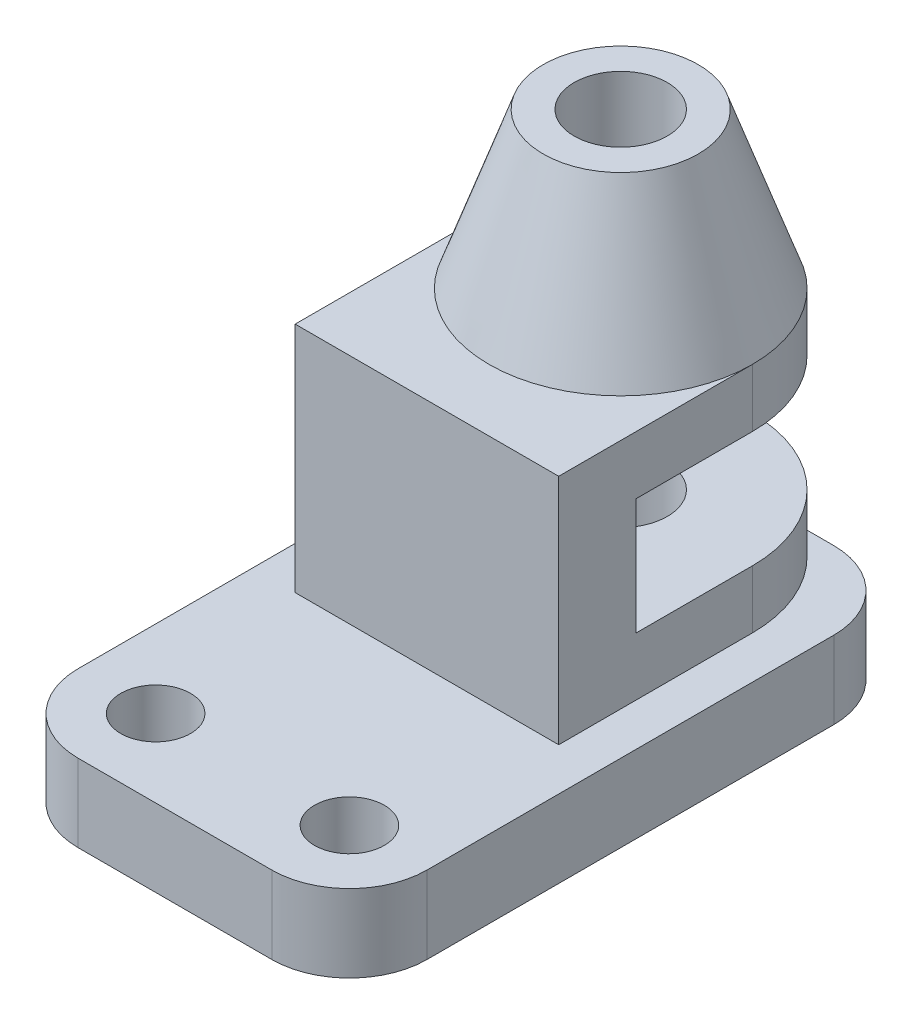
ISO-10303-21;
HEADER;
FILE_DESCRIPTION(('STEP AP214'),'2;1');
FILE_NAME('part.step','',(''),(''),'','','');
FILE_SCHEMA(('AUTOMOTIVE_DESIGN { 1 0 10303 214 1 1 1 1 }'));
ENDSEC;
DATA;
#1=APPLICATION_CONTEXT('core data for automotive mechanical design processes');
#2=APPLICATION_PROTOCOL_DEFINITION('international standard','automotive_design',2000,#1);
#3=PRODUCT_CONTEXT('',#1,'mechanical');
#4=PRODUCT('Part','Part','',(#3));
#5=PRODUCT_RELATED_PRODUCT_CATEGORY('part','',(#4));
#6=PRODUCT_DEFINITION_FORMATION('','',#4);
#7=PRODUCT_DEFINITION_CONTEXT('part definition',#1,'design');
#8=PRODUCT_DEFINITION('design','',#6,#7);
#9=PRODUCT_DEFINITION_SHAPE('','',#8);
#10=(LENGTH_UNIT() NAMED_UNIT(*) SI_UNIT(.MILLI.,.METRE.));
#11=(NAMED_UNIT(*) PLANE_ANGLE_UNIT() SI_UNIT($,.RADIAN.));
#12=(NAMED_UNIT(*) SI_UNIT($,.STERADIAN.) SOLID_ANGLE_UNIT());
#13=UNCERTAINTY_MEASURE_WITH_UNIT(LENGTH_MEASURE(1.E-05),#10,'distance_accuracy_value','');
#14=(GEOMETRIC_REPRESENTATION_CONTEXT(3) GLOBAL_UNCERTAINTY_ASSIGNED_CONTEXT((#13)) GLOBAL_UNIT_ASSIGNED_CONTEXT((#10,
#11,#12)) REPRESENTATION_CONTEXT('',''));
#15=CARTESIAN_POINT('',(0.,0.,0.));
#16=DIRECTION('',(0.,0.,1.));
#17=DIRECTION('',(1.,0.,0.));
#18=AXIS2_PLACEMENT_3D('',#15,#16,#17);
#19=CARTESIAN_POINT('',(0.,80.,-42.5));
#20=DIRECTION('',(0.,1.,0.));
#21=DIRECTION('',(0.,0.,1.));
#22=AXIS2_PLACEMENT_3D('',#19,#20,#21);
#23=PLANE('',#22);
#24=DIRECTION('',(0.,0.,-1.));
#25=VECTOR('',#24,1.);
#26=CARTESIAN_POINT('',(34.,80.,7.49999999999997));
#27=LINE('',#26,#25);
#28=CARTESIAN_POINT('',(34.,80.,7.49999999999997));
#29=VERTEX_POINT('',#28);
#30=CARTESIAN_POINT('',(34.,80.,-42.5));
#31=VERTEX_POINT('',#30);
#32=EDGE_CURVE('E186',#29,#31,#27,.T.);
#33=ORIENTED_EDGE('',*,*,#32,.T.);
#34=CARTESIAN_POINT('',(0.,80.,-42.5));
#35=DIRECTION('',(0.,-1.,0.));
#36=DIRECTION('',(1.,0.,0.));
#37=AXIS2_PLACEMENT_3D('',#34,#35,#36);
#38=CIRCLE('',#37,34.);
#39=CARTESIAN_POINT('',(-34.,80.,-42.5));
#40=VERTEX_POINT('',#39);
#41=EDGE_CURVE('E184',#31,#40,#38,.T.);
#42=ORIENTED_EDGE('',*,*,#41,.T.);
#43=DIRECTION('',(0.,0.,1.));
#44=VECTOR('',#43,1.);
#45=CARTESIAN_POINT('',(-34.,80.,-42.5));
#46=LINE('',#45,#44);
#47=CARTESIAN_POINT('',(-34.,80.,7.49999999999998));
#48=VERTEX_POINT('',#47);
#49=EDGE_CURVE('E164',#40,#48,#46,.T.);
#50=ORIENTED_EDGE('',*,*,#49,.T.);
#51=DIRECTION('',(1.,0.,0.));
#52=VECTOR('',#51,1.);
#53=CARTESIAN_POINT('',(-34.,80.,7.49999999999998));
#54=LINE('',#53,#52);
#55=EDGE_CURVE('E172',#48,#29,#54,.T.);
#56=ORIENTED_EDGE('',*,*,#55,.T.);
#57=EDGE_LOOP('',(#33,#42,#50,#56));
#58=FACE_BOUND('',#57,.T.);
#59=ADVANCED_FACE('F39',(#58),#23,.T.);
#60=CARTESIAN_POINT('',(-34.,80.,-42.5));
#61=DIRECTION('',(1.,0.,0.));
#62=DIRECTION('',(0.,0.,-1.));
#63=AXIS2_PLACEMENT_3D('',#60,#61,#62);
#64=PLANE('',#63);
#65=DIRECTION('',(0.,0.,1.));
#66=VECTOR('',#65,1.);
#67=CARTESIAN_POINT('',(-34.,35.,-42.5));
#68=LINE('',#67,#66);
#69=CARTESIAN_POINT('',(-34.,35.,-42.5));
#70=VERTEX_POINT('',#69);
#71=CARTESIAN_POINT('',(-34.,35.,-12.5));
#72=VERTEX_POINT('',#71);
#73=EDGE_CURVE('E335',#70,#72,#68,.T.);
#74=ORIENTED_EDGE('',*,*,#73,.F.);
#75=DIRECTION('',(0.,-1.,0.));
#76=VECTOR('',#75,1.);
#77=CARTESIAN_POINT('',(-34.,80.,-42.5));
#78=LINE('',#77,#76);
#79=CARTESIAN_POINT('',(-34.,20.,-42.5));
#80=VERTEX_POINT('',#79);
#81=EDGE_CURVE('E65',#70,#80,#78,.T.);
#82=ORIENTED_EDGE('',*,*,#81,.T.);
#83=DIRECTION('',(0.,0.,1.));
#84=VECTOR('',#83,1.);
#85=CARTESIAN_POINT('',(-34.,20.,-42.5));
#86=LINE('',#85,#84);
#87=CARTESIAN_POINT('',(-34.,20.,7.49999999999998));
#88=VERTEX_POINT('',#87);
#89=EDGE_CURVE('E197',#80,#88,#86,.T.);
#90=ORIENTED_EDGE('',*,*,#89,.T.);
#91=DIRECTION('',(0.,-1.,0.));
#92=VECTOR('',#91,1.);
#93=CARTESIAN_POINT('',(-34.,80.,7.49999999999998));
#94=LINE('',#93,#92);
#95=EDGE_CURVE('E169',#48,#88,#94,.T.);
#96=ORIENTED_EDGE('',*,*,#95,.F.);
#97=ORIENTED_EDGE('',*,*,#49,.F.);
#98=CARTESIAN_POINT('',(-34.,65.,-42.5));
#99=VERTEX_POINT('',#98);
#100=EDGE_CURVE('E167',#40,#99,#78,.T.);
#101=ORIENTED_EDGE('',*,*,#100,.T.);
#102=DIRECTION('',(0.,0.,1.));
#103=VECTOR('',#102,1.);
#104=CARTESIAN_POINT('',(-34.,65.,-42.5));
#105=LINE('',#104,#103);
#106=CARTESIAN_POINT('',(-34.,65.,-12.5));
#107=VERTEX_POINT('',#106);
#108=EDGE_CURVE('E57',#99,#107,#105,.T.);
#109=ORIENTED_EDGE('',*,*,#108,.T.);
#110=DIRECTION('',(0.,1.,0.));
#111=VECTOR('',#110,1.);
#112=CARTESIAN_POINT('',(-34.,35.,-12.5));
#113=LINE('',#112,#111);
#114=EDGE_CURVE('E329',#72,#107,#113,.T.);
#115=ORIENTED_EDGE('',*,*,#114,.F.);
#116=EDGE_LOOP('',(#74,#82,#90,#96,#97,#101,#109,#115));
#117=FACE_BOUND('',#116,.T.);
#118=ADVANCED_FACE('F166',(#117),#64,.F.);
#119=CARTESIAN_POINT('',(34.,80.,7.49999999999997));
#120=DIRECTION('',(-1.,0.,0.));
#121=DIRECTION('',(0.,0.,1.));
#122=AXIS2_PLACEMENT_3D('',#119,#120,#121);
#123=PLANE('',#122);
#124=DIRECTION('',(0.,0.,-1.));
#125=VECTOR('',#124,1.);
#126=CARTESIAN_POINT('',(34.,35.,-12.5));
#127=LINE('',#126,#125);
#128=CARTESIAN_POINT('',(34.,35.,-12.5));
#129=VERTEX_POINT('',#128);
#130=CARTESIAN_POINT('',(34.,35.,-42.5));
#131=VERTEX_POINT('',#130);
#132=EDGE_CURVE('E344',#129,#131,#127,.T.);
#133=ORIENTED_EDGE('',*,*,#132,.F.);
#134=DIRECTION('',(0.,1.,0.));
#135=VECTOR('',#134,1.);
#136=CARTESIAN_POINT('',(34.,35.,-12.5));
#137=LINE('',#136,#135);
#138=CARTESIAN_POINT('',(34.,65.,-12.5));
#139=VERTEX_POINT('',#138);
#140=EDGE_CURVE('E200',#129,#139,#137,.T.);
#141=ORIENTED_EDGE('',*,*,#140,.T.);
#142=DIRECTION('',(0.,0.,-1.));
#143=VECTOR('',#142,1.);
#144=CARTESIAN_POINT('',(34.,65.,-12.5));
#145=LINE('',#144,#143);
#146=CARTESIAN_POINT('',(34.,65.,-42.5));
#147=VERTEX_POINT('',#146);
#148=EDGE_CURVE('E336',#139,#147,#145,.T.);
#149=ORIENTED_EDGE('',*,*,#148,.T.);
#150=DIRECTION('',(0.,-1.,0.));
#151=VECTOR('',#150,1.);
#152=CARTESIAN_POINT('',(34.,80.,-42.5));
#153=LINE('',#152,#151);
#154=EDGE_CURVE('E207',#31,#147,#153,.T.);
#155=ORIENTED_EDGE('',*,*,#154,.F.);
#156=ORIENTED_EDGE('',*,*,#32,.F.);
#157=DIRECTION('',(0.,-1.,0.));
#158=VECTOR('',#157,1.);
#159=CARTESIAN_POINT('',(34.,80.,7.49999999999997));
#160=LINE('',#159,#158);
#161=CARTESIAN_POINT('',(34.,20.,7.49999999999997));
#162=VERTEX_POINT('',#161);
#163=EDGE_CURVE('E209',#29,#162,#160,.T.);
#164=ORIENTED_EDGE('',*,*,#163,.T.);
#165=DIRECTION('',(0.,0.,-1.));
#166=VECTOR('',#165,1.);
#167=CARTESIAN_POINT('',(34.,20.,7.49999999999997));
#168=LINE('',#167,#166);
#169=CARTESIAN_POINT('',(34.,20.,-42.5));
#170=VERTEX_POINT('',#169);
#171=EDGE_CURVE('E203',#162,#170,#168,.T.);
#172=ORIENTED_EDGE('',*,*,#171,.T.);
#173=EDGE_CURVE('E182',#131,#170,#153,.T.);
#174=ORIENTED_EDGE('',*,*,#173,.F.);
#175=EDGE_LOOP('',(#133,#141,#149,#155,#156,#164,#172,#174));
#176=FACE_BOUND('',#175,.T.);
#177=ADVANCED_FACE('F324',(#176),#123,.F.);
#178=CARTESIAN_POINT('',(0.,80.,-42.5));
#179=DIRECTION('',(0.,-1.,0.));
#180=DIRECTION('',(0.,0.,-1.));
#181=AXIS2_PLACEMENT_3D('',#178,#179,#180);
#182=CYLINDRICAL_SURFACE('',#181,34.);
#183=CARTESIAN_POINT('',(0.,35.,-42.5));
#184=DIRECTION('',(0.,1.,0.));
#185=DIRECTION('',(0.,0.,1.));
#186=AXIS2_PLACEMENT_3D('',#183,#184,#185);
#187=CIRCLE('',#186,34.);
#188=EDGE_CURVE('E331',#131,#70,#187,.T.);
#189=ORIENTED_EDGE('',*,*,#188,.F.);
#190=ORIENTED_EDGE('',*,*,#173,.T.);
#191=CARTESIAN_POINT('',(0.,20.,-42.5));
#192=DIRECTION('',(0.,1.,0.));
#193=DIRECTION('',(0.,0.,1.));
#194=AXIS2_PLACEMENT_3D('',#191,#192,#193);
#195=CIRCLE('',#194,34.);
#196=CARTESIAN_POINT('',(16.,20.,-72.5));
#197=VERTEX_POINT('',#196);
#198=EDGE_CURVE('E49',#170,#197,#195,.T.);
#199=ORIENTED_EDGE('',*,*,#198,.T.);
#200=CARTESIAN_POINT('',(-16.0000000000001,20.,-72.5));
#201=VERTEX_POINT('',#200);
#202=EDGE_CURVE('E50',#197,#201,#195,.T.);
#203=ORIENTED_EDGE('',*,*,#202,.T.);
#204=EDGE_CURVE('E11',#201,#80,#195,.T.);
#205=ORIENTED_EDGE('',*,*,#204,.T.);
#206=ORIENTED_EDGE('',*,*,#81,.F.);
#207=EDGE_LOOP('',(#189,#190,#199,#203,#205,#206));
#208=FACE_BOUND('',#207,.T.);
#209=ADVANCED_FACE('F319',(#208),#182,.T.);
#210=CARTESIAN_POINT('',(25.,20.,-52.5));
#211=DIRECTION('',(0.,1.,0.));
#212=DIRECTION('',(0.,0.,1.));
#213=AXIS2_PLACEMENT_3D('',#210,#211,#212);
#214=PLANE('',#213);
#215=ORIENTED_EDGE('',*,*,#204,.F.);
#216=DIRECTION('',(-1.,0.,0.));
#217=VECTOR('',#216,1.);
#218=CARTESIAN_POINT('',(-24.9999999999998,20.,-72.5));
#219=LINE('',#218,#217);
#220=CARTESIAN_POINT('',(-24.9999999999998,20.,-72.5));
#221=VERTEX_POINT('',#220);
#222=EDGE_CURVE('E229',#201,#221,#219,.T.);
#223=ORIENTED_EDGE('',*,*,#222,.T.);
#224=CARTESIAN_POINT('',(-25.,20.,-52.5));
#225=DIRECTION('',(0.,1.,0.));
#226=DIRECTION('',(0.,0.,1.));
#227=AXIS2_PLACEMENT_3D('',#224,#225,#226);
#228=CIRCLE('',#227,20.);
#229=CARTESIAN_POINT('',(-45.,20.,-52.4999999999999));
#230=VERTEX_POINT('',#229);
#231=EDGE_CURVE('E234',#221,#230,#228,.T.);
#232=ORIENTED_EDGE('',*,*,#231,.T.);
#233=DIRECTION('',(0.,0.,1.));
#234=VECTOR('',#233,1.);
#235=CARTESIAN_POINT('',(-45.,20.,52.4999999999998));
#236=LINE('',#235,#234);
#237=CARTESIAN_POINT('',(-45.,20.,52.4999999999998));
#238=VERTEX_POINT('',#237);
#239=EDGE_CURVE('E237',#230,#238,#236,.T.);
#240=ORIENTED_EDGE('',*,*,#239,.T.);
#241=CARTESIAN_POINT('',(-25.,20.,52.5));
#242=DIRECTION('',(0.,1.,0.));
#243=DIRECTION('',(0.,0.,-1.));
#244=AXIS2_PLACEMENT_3D('',#241,#242,#243);
#245=CIRCLE('',#244,20.);
#246=CARTESIAN_POINT('',(-24.9999999999999,20.,72.5));
#247=VERTEX_POINT('',#246);
#248=EDGE_CURVE('E239',#238,#247,#245,.T.);
#249=ORIENTED_EDGE('',*,*,#248,.T.);
#250=DIRECTION('',(1.,0.,0.));
#251=VECTOR('',#250,1.);
#252=CARTESIAN_POINT('',(-24.9999999999999,20.,72.5));
#253=LINE('',#252,#251);
#254=CARTESIAN_POINT('',(24.9999999999999,20.,72.5));
#255=VERTEX_POINT('',#254);
#256=EDGE_CURVE('E241',#247,#255,#253,.T.);
#257=ORIENTED_EDGE('',*,*,#256,.T.);
#258=CARTESIAN_POINT('',(25.,20.,52.5));
#259=DIRECTION('',(0.,1.,0.));
#260=DIRECTION('',(0.,0.,-1.));
#261=AXIS2_PLACEMENT_3D('',#258,#259,#260);
#262=CIRCLE('',#261,20.);
#263=CARTESIAN_POINT('',(45.,20.,52.4999999999998));
#264=VERTEX_POINT('',#263);
#265=EDGE_CURVE('E243',#255,#264,#262,.T.);
#266=ORIENTED_EDGE('',*,*,#265,.T.);
#267=DIRECTION('',(0.,0.,-1.));
#268=VECTOR('',#267,1.);
#269=CARTESIAN_POINT('',(45.,20.,52.4999999999998));
#270=LINE('',#269,#268);
#271=CARTESIAN_POINT('',(45.,20.,-52.4999999999999));
#272=VERTEX_POINT('',#271);
#273=EDGE_CURVE('E245',#264,#272,#270,.T.);
#274=ORIENTED_EDGE('',*,*,#273,.T.);
#275=CARTESIAN_POINT('',(25.,20.,-52.5));
#276=DIRECTION('',(0.,1.,0.));
#277=DIRECTION('',(0.,0.,1.));
#278=AXIS2_PLACEMENT_3D('',#275,#276,#277);
#279=CIRCLE('',#278,20.);
#280=CARTESIAN_POINT('',(24.9999999999999,20.,-72.5));
#281=VERTEX_POINT('',#280);
#282=EDGE_CURVE('E226',#272,#281,#279,.T.);
#283=ORIENTED_EDGE('',*,*,#282,.T.);
#284=EDGE_CURVE('E231',#281,#197,#219,.T.);
#285=ORIENTED_EDGE('',*,*,#284,.T.);
#286=ORIENTED_EDGE('',*,*,#198,.F.);
#287=ORIENTED_EDGE('',*,*,#171,.F.);
#288=DIRECTION('',(1.,0.,0.));
#289=VECTOR('',#288,1.);
#290=CARTESIAN_POINT('',(-34.,20.,7.49999999999998));
#291=LINE('',#290,#289);
#292=EDGE_CURVE('E199',#88,#162,#291,.T.);
#293=ORIENTED_EDGE('',*,*,#292,.F.);
#294=ORIENTED_EDGE('',*,*,#89,.F.);
#295=EDGE_LOOP('',(#215,#223,#232,#240,#249,#257,#266,#274,#283,#285,#286,#287,#293,#294));
#296=FACE_BOUND('',#295,.T.);
#297=CARTESIAN_POINT('',(25.,20.,52.5));
#298=DIRECTION('',(0.,1.,0.));
#299=DIRECTION('',(0.,0.,1.));
#300=AXIS2_PLACEMENT_3D('',#297,#298,#299);
#301=CIRCLE('',#300,9.);
#302=CARTESIAN_POINT('',(25.,20.,61.5));
#303=VERTEX_POINT('',#302);
#304=EDGE_CURVE('E220',#303,#303,#301,.T.);
#305=ORIENTED_EDGE('',*,*,#304,.F.);
#306=EDGE_LOOP('',(#305));
#307=FACE_BOUND('',#306,.T.);
#308=CARTESIAN_POINT('',(-25.,20.,52.5));
#309=DIRECTION('',(0.,1.,0.));
#310=DIRECTION('',(0.,0.,1.));
#311=AXIS2_PLACEMENT_3D('',#308,#309,#310);
#312=CIRCLE('',#311,9.);
#313=CARTESIAN_POINT('',(-25.,20.,61.5));
#314=VERTEX_POINT('',#313);
#315=EDGE_CURVE('E214',#314,#314,#312,.T.);
#316=ORIENTED_EDGE('',*,*,#315,.F.);
#317=EDGE_LOOP('',(#316));
#318=FACE_BOUND('',#317,.T.);
#319=ADVANCED_FACE('F308',(#296,#307,#318),#214,.T.);
#320=CARTESIAN_POINT('',(25.,0.,-52.5));
#321=DIRECTION('',(0.,1.,0.));
#322=DIRECTION('',(0.,0.,1.));
#323=AXIS2_PLACEMENT_3D('',#320,#321,#322);
#324=PLANE('',#323);
#325=CARTESIAN_POINT('',(0.,0.,-42.5));
#326=DIRECTION('',(0.,1.,0.));
#327=DIRECTION('',(-1.,0.,0.));
#328=AXIS2_PLACEMENT_3D('',#325,#326,#327);
#329=CIRCLE('',#328,12.);
#330=CARTESIAN_POINT('',(-12.,0.,-42.5));
#331=VERTEX_POINT('',#330);
#332=EDGE_CURVE('E358',#331,#331,#329,.T.);
#333=ORIENTED_EDGE('',*,*,#332,.T.);
#334=EDGE_LOOP('',(#333));
#335=FACE_BOUND('',#334,.T.);
#336=CARTESIAN_POINT('',(25.,0.,-52.5));
#337=DIRECTION('',(0.,1.,0.));
#338=DIRECTION('',(0.,0.,1.));
#339=AXIS2_PLACEMENT_3D('',#336,#337,#338);
#340=CIRCLE('',#339,20.);
#341=CARTESIAN_POINT('',(45.,0.,-52.4999999999999));
#342=VERTEX_POINT('',#341);
#343=CARTESIAN_POINT('',(24.9999999999999,0.,-72.5));
#344=VERTEX_POINT('',#343);
#345=EDGE_CURVE('E223',#342,#344,#340,.T.);
#346=ORIENTED_EDGE('',*,*,#345,.F.);
#347=DIRECTION('',(0.,0.,-1.));
#348=VECTOR('',#347,1.);
#349=CARTESIAN_POINT('',(45.,0.,52.4999999999998));
#350=LINE('',#349,#348);
#351=CARTESIAN_POINT('',(45.,0.,52.4999999999998));
#352=VERTEX_POINT('',#351);
#353=EDGE_CURVE('E230',#352,#342,#350,.T.);
#354=ORIENTED_EDGE('',*,*,#353,.F.);
#355=CARTESIAN_POINT('',(25.,0.,52.5));
#356=DIRECTION('',(0.,1.,0.));
#357=DIRECTION('',(0.,0.,-1.));
#358=AXIS2_PLACEMENT_3D('',#355,#356,#357);
#359=CIRCLE('',#358,20.);
#360=CARTESIAN_POINT('',(24.9999999999999,0.,72.5));
#361=VERTEX_POINT('',#360);
#362=EDGE_CURVE('E260',#361,#352,#359,.T.);
#363=ORIENTED_EDGE('',*,*,#362,.F.);
#364=DIRECTION('',(1.,0.,0.));
#365=VECTOR('',#364,1.);
#366=CARTESIAN_POINT('',(-24.9999999999999,0.,72.5));
#367=LINE('',#366,#365);
#368=CARTESIAN_POINT('',(-24.9999999999999,0.,72.5));
#369=VERTEX_POINT('',#368);
#370=EDGE_CURVE('E258',#369,#361,#367,.T.);
#371=ORIENTED_EDGE('',*,*,#370,.F.);
#372=CARTESIAN_POINT('',(-25.,0.,52.5));
#373=DIRECTION('',(0.,1.,0.));
#374=DIRECTION('',(0.,0.,-1.));
#375=AXIS2_PLACEMENT_3D('',#372,#373,#374);
#376=CIRCLE('',#375,20.);
#377=CARTESIAN_POINT('',(-45.,0.,52.4999999999998));
#378=VERTEX_POINT('',#377);
#379=EDGE_CURVE('E256',#378,#369,#376,.T.);
#380=ORIENTED_EDGE('',*,*,#379,.F.);
#381=DIRECTION('',(0.,0.,1.));
#382=VECTOR('',#381,1.);
#383=CARTESIAN_POINT('',(-45.,0.,52.4999999999998));
#384=LINE('',#383,#382);
#385=CARTESIAN_POINT('',(-45.,0.,-52.4999999999999));
#386=VERTEX_POINT('',#385);
#387=EDGE_CURVE('E254',#386,#378,#384,.T.);
#388=ORIENTED_EDGE('',*,*,#387,.F.);
#389=CARTESIAN_POINT('',(-25.,0.,-52.5));
#390=DIRECTION('',(0.,1.,0.));
#391=DIRECTION('',(0.,0.,1.));
#392=AXIS2_PLACEMENT_3D('',#389,#390,#391);
#393=CIRCLE('',#392,20.);
#394=CARTESIAN_POINT('',(-24.9999999999998,0.,-72.5));
#395=VERTEX_POINT('',#394);
#396=EDGE_CURVE('E252',#395,#386,#393,.T.);
#397=ORIENTED_EDGE('',*,*,#396,.F.);
#398=DIRECTION('',(-1.,0.,0.));
#399=VECTOR('',#398,1.);
#400=CARTESIAN_POINT('',(-24.9999999999998,0.,-72.5));
#401=LINE('',#400,#399);
#402=EDGE_CURVE('E250',#344,#395,#401,.T.);
#403=ORIENTED_EDGE('',*,*,#402,.F.);
#404=EDGE_LOOP('',(#346,#354,#363,#371,#380,#388,#397,#403));
#405=FACE_BOUND('',#404,.T.);
#406=CARTESIAN_POINT('',(25.,0.,52.5));
#407=DIRECTION('',(0.,1.,0.));
#408=DIRECTION('',(0.,0.,1.));
#409=AXIS2_PLACEMENT_3D('',#406,#407,#408);
#410=CIRCLE('',#409,9.);
#411=CARTESIAN_POINT('',(25.,0.,61.5));
#412=VERTEX_POINT('',#411);
#413=EDGE_CURVE('E217',#412,#412,#410,.T.);
#414=ORIENTED_EDGE('',*,*,#413,.T.);
#415=EDGE_LOOP('',(#414));
#416=FACE_BOUND('',#415,.T.);
#417=CARTESIAN_POINT('',(-25.,0.,52.5));
#418=DIRECTION('',(0.,1.,0.));
#419=DIRECTION('',(0.,0.,1.));
#420=AXIS2_PLACEMENT_3D('',#417,#418,#419);
#421=CIRCLE('',#420,9.);
#422=CARTESIAN_POINT('',(-25.,0.,61.5));
#423=VERTEX_POINT('',#422);
#424=EDGE_CURVE('E213',#423,#423,#421,.T.);
#425=ORIENTED_EDGE('',*,*,#424,.T.);
#426=EDGE_LOOP('',(#425));
#427=FACE_BOUND('',#426,.T.);
#428=ADVANCED_FACE('F295',(#335,#405,#416,#427),#324,.F.);
#429=CARTESIAN_POINT('',(25.,20.,-52.5));
#430=DIRECTION('',(0.,-1.,0.));
#431=DIRECTION('',(0.,0.,-1.));
#432=AXIS2_PLACEMENT_3D('',#429,#430,#431);
#433=CYLINDRICAL_SURFACE('',#432,20.);
#434=ORIENTED_EDGE('',*,*,#345,.T.);
#435=DIRECTION('',(0.,-1.,0.));
#436=VECTOR('',#435,1.);
#437=CARTESIAN_POINT('',(24.9999999999999,20.,-72.5));
#438=LINE('',#437,#436);
#439=EDGE_CURVE('E43',#281,#344,#438,.T.);
#440=ORIENTED_EDGE('',*,*,#439,.F.);
#441=ORIENTED_EDGE('',*,*,#282,.F.);
#442=DIRECTION('',(0.,-1.,0.));
#443=VECTOR('',#442,1.);
#444=CARTESIAN_POINT('',(45.,20.,-52.4999999999999));
#445=LINE('',#444,#443);
#446=EDGE_CURVE('E247',#272,#342,#445,.T.);
#447=ORIENTED_EDGE('',*,*,#446,.T.);
#448=EDGE_LOOP('',(#434,#440,#441,#447));
#449=FACE_BOUND('',#448,.T.);
#450=ADVANCED_FACE('F41',(#449),#433,.T.);
#451=CARTESIAN_POINT('',(-24.9999999999998,20.,-72.5));
#452=DIRECTION('',(0.,0.,1.));
#453=DIRECTION('',(1.,0.,0.));
#454=AXIS2_PLACEMENT_3D('',#451,#452,#453);
#455=PLANE('',#454);
#456=ORIENTED_EDGE('',*,*,#402,.T.);
#457=DIRECTION('',(0.,-1.,0.));
#458=VECTOR('',#457,1.);
#459=CARTESIAN_POINT('',(-24.9999999999998,20.,-72.5));
#460=LINE('',#459,#458);
#461=EDGE_CURVE('E279',#221,#395,#460,.T.);
#462=ORIENTED_EDGE('',*,*,#461,.F.);
#463=ORIENTED_EDGE('',*,*,#222,.F.);
#464=EDGE_CURVE('E235',#197,#201,#219,.T.);
#465=ORIENTED_EDGE('',*,*,#464,.F.);
#466=ORIENTED_EDGE('',*,*,#284,.F.);
#467=ORIENTED_EDGE('',*,*,#439,.T.);
#468=EDGE_LOOP('',(#456,#462,#463,#465,#466,#467));
#469=FACE_BOUND('',#468,.T.);
#470=ADVANCED_FACE('F288',(#469),#455,.F.);
#471=CARTESIAN_POINT('',(-25.,20.,-52.5));
#472=DIRECTION('',(0.,-1.,0.));
#473=DIRECTION('',(0.,0.,-1.));
#474=AXIS2_PLACEMENT_3D('',#471,#472,#473);
#475=CYLINDRICAL_SURFACE('',#474,20.);
#476=ORIENTED_EDGE('',*,*,#396,.T.);
#477=DIRECTION('',(0.,-1.,0.));
#478=VECTOR('',#477,1.);
#479=CARTESIAN_POINT('',(-45.,20.,-52.4999999999999));
#480=LINE('',#479,#478);
#481=EDGE_CURVE('E277',#230,#386,#480,.T.);
#482=ORIENTED_EDGE('',*,*,#481,.F.);
#483=ORIENTED_EDGE('',*,*,#231,.F.);
#484=ORIENTED_EDGE('',*,*,#461,.T.);
#485=EDGE_LOOP('',(#476,#482,#483,#484));
#486=FACE_BOUND('',#485,.T.);
#487=ADVANCED_FACE('F301',(#486),#475,.T.);
#488=CARTESIAN_POINT('',(-45.,20.,52.4999999999998));
#489=DIRECTION('',(1.,0.,0.));
#490=DIRECTION('',(0.,0.,-1.));
#491=AXIS2_PLACEMENT_3D('',#488,#489,#490);
#492=PLANE('',#491);
#493=ORIENTED_EDGE('',*,*,#387,.T.);
#494=DIRECTION('',(0.,-1.,0.));
#495=VECTOR('',#494,1.);
#496=CARTESIAN_POINT('',(-45.,20.,52.4999999999998));
#497=LINE('',#496,#495);
#498=EDGE_CURVE('E274',#238,#378,#497,.T.);
#499=ORIENTED_EDGE('',*,*,#498,.F.);
#500=ORIENTED_EDGE('',*,*,#239,.F.);
#501=ORIENTED_EDGE('',*,*,#481,.T.);
#502=EDGE_LOOP('',(#493,#499,#500,#501));
#503=FACE_BOUND('',#502,.T.);
#504=ADVANCED_FACE('F304',(#503),#492,.F.);
#505=CARTESIAN_POINT('',(-25.,20.,52.5));
#506=DIRECTION('',(0.,-1.,0.));
#507=DIRECTION('',(0.,0.,-1.));
#508=AXIS2_PLACEMENT_3D('',#505,#506,#507);
#509=CYLINDRICAL_SURFACE('',#508,20.);
#510=ORIENTED_EDGE('',*,*,#379,.T.);
#511=DIRECTION('',(0.,-1.,0.));
#512=VECTOR('',#511,1.);
#513=CARTESIAN_POINT('',(-24.9999999999999,20.,72.5));
#514=LINE('',#513,#512);
#515=EDGE_CURVE('E271',#247,#369,#514,.T.);
#516=ORIENTED_EDGE('',*,*,#515,.F.);
#517=ORIENTED_EDGE('',*,*,#248,.F.);
#518=ORIENTED_EDGE('',*,*,#498,.T.);
#519=EDGE_LOOP('',(#510,#516,#517,#518));
#520=FACE_BOUND('',#519,.T.);
#521=ADVANCED_FACE('F418',(#520),#509,.T.);
#522=CARTESIAN_POINT('',(-24.9999999999999,20.,72.5));
#523=DIRECTION('',(0.,0.,-1.));
#524=DIRECTION('',(-1.,0.,0.));
#525=AXIS2_PLACEMENT_3D('',#522,#523,#524);
#526=PLANE('',#525);
#527=ORIENTED_EDGE('',*,*,#370,.T.);
#528=DIRECTION('',(0.,-1.,0.));
#529=VECTOR('',#528,1.);
#530=CARTESIAN_POINT('',(24.9999999999999,20.,72.5));
#531=LINE('',#530,#529);
#532=EDGE_CURVE('E268',#255,#361,#531,.T.);
#533=ORIENTED_EDGE('',*,*,#532,.F.);
#534=ORIENTED_EDGE('',*,*,#256,.F.);
#535=ORIENTED_EDGE('',*,*,#515,.T.);
#536=EDGE_LOOP('',(#527,#533,#534,#535));
#537=FACE_BOUND('',#536,.T.);
#538=ADVANCED_FACE('F414',(#537),#526,.F.);
#539=CARTESIAN_POINT('',(25.,20.,52.5));
#540=DIRECTION('',(0.,-1.,0.));
#541=DIRECTION('',(0.,0.,-1.));
#542=AXIS2_PLACEMENT_3D('',#539,#540,#541);
#543=CYLINDRICAL_SURFACE('',#542,20.);
#544=ORIENTED_EDGE('',*,*,#362,.T.);
#545=DIRECTION('',(0.,-1.,0.));
#546=VECTOR('',#545,1.);
#547=CARTESIAN_POINT('',(45.,20.,52.4999999999998));
#548=LINE('',#547,#546);
#549=EDGE_CURVE('E265',#264,#352,#548,.T.);
#550=ORIENTED_EDGE('',*,*,#549,.F.);
#551=ORIENTED_EDGE('',*,*,#265,.F.);
#552=ORIENTED_EDGE('',*,*,#532,.T.);
#553=EDGE_LOOP('',(#544,#550,#551,#552));
#554=FACE_BOUND('',#553,.T.);
#555=ADVANCED_FACE('F410',(#554),#543,.T.);
#556=CARTESIAN_POINT('',(45.,20.,52.4999999999998));
#557=DIRECTION('',(-1.,0.,0.));
#558=DIRECTION('',(0.,0.,1.));
#559=AXIS2_PLACEMENT_3D('',#556,#557,#558);
#560=PLANE('',#559);
#561=ORIENTED_EDGE('',*,*,#353,.T.);
#562=ORIENTED_EDGE('',*,*,#446,.F.);
#563=ORIENTED_EDGE('',*,*,#273,.F.);
#564=ORIENTED_EDGE('',*,*,#549,.T.);
#565=EDGE_LOOP('',(#561,#562,#563,#564));
#566=FACE_BOUND('',#565,.T.);
#567=ADVANCED_FACE('F402',(#566),#560,.F.);
#568=CARTESIAN_POINT('',(25.,20.,52.5));
#569=DIRECTION('',(0.,-1.,0.));
#570=DIRECTION('',(0.,0.,-1.));
#571=AXIS2_PLACEMENT_3D('',#568,#569,#570);
#572=CYLINDRICAL_SURFACE('',#571,9.);
#573=ORIENTED_EDGE('',*,*,#304,.T.);
#574=EDGE_LOOP('',(#573));
#575=FACE_BOUND('',#574,.T.);
#576=ORIENTED_EDGE('',*,*,#413,.F.);
#577=EDGE_LOOP('',(#576));
#578=FACE_BOUND('',#577,.T.);
#579=ADVANCED_FACE('F398',(#575,#578),#572,.F.);
#580=CARTESIAN_POINT('',(-25.,20.,52.5));
#581=DIRECTION('',(0.,-1.,0.));
#582=DIRECTION('',(0.,0.,-1.));
#583=AXIS2_PLACEMENT_3D('',#580,#581,#582);
#584=CYLINDRICAL_SURFACE('',#583,9.);
#585=ORIENTED_EDGE('',*,*,#315,.T.);
#586=EDGE_LOOP('',(#585));
#587=FACE_BOUND('',#586,.T.);
#588=ORIENTED_EDGE('',*,*,#424,.F.);
#589=EDGE_LOOP('',(#588));
#590=FACE_BOUND('',#589,.T.);
#591=ADVANCED_FACE('F390',(#587,#590),#584,.F.);
#592=CARTESIAN_POINT('',(0.,20.,-42.5));
#593=DIRECTION('',(0.,1.,0.));
#594=DIRECTION('',(0.,0.,1.));
#595=AXIS2_PLACEMENT_3D('',#592,#593,#594);
#596=PLANE('',#595);
#597=ORIENTED_EDGE('',*,*,#202,.F.);
#598=ORIENTED_EDGE('',*,*,#464,.T.);
#599=EDGE_LOOP('',(#597,#598));
#600=FACE_BOUND('',#599,.T.);
#601=ADVANCED_FACE('F316',(#600),#596,.F.);
#602=CARTESIAN_POINT('',(-34.,80.,7.49999999999998));
#603=DIRECTION('',(0.,0.,-1.));
#604=DIRECTION('',(-1.,0.,0.));
#605=AXIS2_PLACEMENT_3D('',#602,#603,#604);
#606=PLANE('',#605);
#607=ORIENTED_EDGE('',*,*,#292,.T.);
#608=ORIENTED_EDGE('',*,*,#163,.F.);
#609=ORIENTED_EDGE('',*,*,#55,.F.);
#610=ORIENTED_EDGE('',*,*,#95,.T.);
#611=EDGE_LOOP('',(#607,#608,#609,#610));
#612=FACE_BOUND('',#611,.T.);
#613=ADVANCED_FACE('F327',(#612),#606,.F.);
#614=ORIENTED_EDGE('',*,*,#154,.T.);
#615=CARTESIAN_POINT('',(0.,65.,-42.5));
#616=DIRECTION('',(0.,1.,0.));
#617=DIRECTION('',(0.,0.,1.));
#618=AXIS2_PLACEMENT_3D('',#615,#616,#617);
#619=CIRCLE('',#618,34.);
#620=EDGE_CURVE('E181',#147,#99,#619,.T.);
#621=ORIENTED_EDGE('',*,*,#620,.T.);
#622=ORIENTED_EDGE('',*,*,#100,.F.);
#623=CARTESIAN_POINT('',(0.,80.,-42.5));
#624=DIRECTION('',(0.,1.,0.));
#625=DIRECTION('',(0.,0.,1.));
#626=AXIS2_PLACEMENT_3D('',#623,#624,#625);
#627=CIRCLE('',#626,34.);
#628=EDGE_CURVE('E179',#31,#40,#627,.T.);
#629=ORIENTED_EDGE('',*,*,#628,.F.);
#630=EDGE_LOOP('',(#614,#621,#622,#629));
#631=FACE_BOUND('',#630,.T.);
#632=ADVANCED_FACE('F177',(#631),#182,.T.);
#633=CARTESIAN_POINT('',(-34.,35.,-12.5));
#634=DIRECTION('',(0.,0.,1.));
#635=DIRECTION('',(1.,0.,0.));
#636=AXIS2_PLACEMENT_3D('',#633,#634,#635);
#637=PLANE('',#636);
#638=DIRECTION('',(1.,0.,0.));
#639=VECTOR('',#638,1.);
#640=CARTESIAN_POINT('',(-34.,65.,-12.5));
#641=LINE('',#640,#639);
#642=EDGE_CURVE('E339',#107,#139,#641,.T.);
#643=ORIENTED_EDGE('',*,*,#642,.T.);
#644=ORIENTED_EDGE('',*,*,#140,.F.);
#645=DIRECTION('',(1.,0.,0.));
#646=VECTOR('',#645,1.);
#647=CARTESIAN_POINT('',(-34.,35.,-12.5));
#648=LINE('',#647,#646);
#649=EDGE_CURVE('E346',#72,#129,#648,.T.);
#650=ORIENTED_EDGE('',*,*,#649,.F.);
#651=ORIENTED_EDGE('',*,*,#114,.T.);
#652=EDGE_LOOP('',(#643,#644,#650,#651));
#653=FACE_BOUND('',#652,.T.);
#654=ADVANCED_FACE('F386',(#653),#637,.F.);
#655=CARTESIAN_POINT('',(0.,35.,-42.5));
#656=DIRECTION('',(0.,1.,0.));
#657=DIRECTION('',(0.,0.,1.));
#658=AXIS2_PLACEMENT_3D('',#655,#656,#657);
#659=PLANE('',#658);
#660=CARTESIAN_POINT('',(0.,35.,-42.5));
#661=DIRECTION('',(0.,1.,0.));
#662=DIRECTION('',(0.,0.,1.));
#663=AXIS2_PLACEMENT_3D('',#660,#661,#662);
#664=CIRCLE('',#663,12.);
#665=CARTESIAN_POINT('',(-12.,35.,-42.5));
#666=VERTEX_POINT('',#665);
#667=EDGE_CURVE('E190',#666,#666,#664,.T.);
#668=ORIENTED_EDGE('',*,*,#667,.F.);
#669=EDGE_LOOP('',(#668));
#670=FACE_BOUND('',#669,.T.);
#671=ORIENTED_EDGE('',*,*,#73,.T.);
#672=ORIENTED_EDGE('',*,*,#649,.T.);
#673=ORIENTED_EDGE('',*,*,#132,.T.);
#674=ORIENTED_EDGE('',*,*,#188,.T.);
#675=EDGE_LOOP('',(#671,#672,#673,#674));
#676=FACE_BOUND('',#675,.T.);
#677=ADVANCED_FACE('F492',(#670,#676),#659,.T.);
#678=CARTESIAN_POINT('',(0.,65.,-42.5));
#679=DIRECTION('',(0.,1.,0.));
#680=DIRECTION('',(0.,0.,1.));
#681=AXIS2_PLACEMENT_3D('',#678,#679,#680);
#682=PLANE('',#681);
#683=CARTESIAN_POINT('',(0.,65.,-42.5));
#684=DIRECTION('',(0.,1.,0.));
#685=DIRECTION('',(0.,0.,1.));
#686=AXIS2_PLACEMENT_3D('',#683,#684,#685);
#687=CIRCLE('',#686,12.);
#688=CARTESIAN_POINT('',(-12.,65.,-42.5));
#689=VERTEX_POINT('',#688);
#690=EDGE_CURVE('E355',#689,#689,#687,.T.);
#691=ORIENTED_EDGE('',*,*,#690,.T.);
#692=EDGE_LOOP('',(#691));
#693=FACE_BOUND('',#692,.T.);
#694=ORIENTED_EDGE('',*,*,#108,.F.);
#695=ORIENTED_EDGE('',*,*,#620,.F.);
#696=ORIENTED_EDGE('',*,*,#148,.F.);
#697=ORIENTED_EDGE('',*,*,#642,.F.);
#698=EDGE_LOOP('',(#694,#695,#696,#697));
#699=FACE_BOUND('',#698,.T.);
#700=ADVANCED_FACE('F496',(#693,#699),#682,.F.);
#701=CARTESIAN_POINT('',(0.,120.,-42.5));
#702=DIRECTION('',(0.,1.,0.));
#703=DIRECTION('',(-1.,0.,0.));
#704=AXIS2_PLACEMENT_3D('',#701,#702,#703);
#705=PLANE('',#704);
#706=CARTESIAN_POINT('',(0.,120.,-42.5));
#707=DIRECTION('',(0.,1.,0.));
#708=DIRECTION('',(-1.,0.,0.));
#709=AXIS2_PLACEMENT_3D('',#706,#707,#708);
#710=CIRCLE('',#709,12.);
#711=CARTESIAN_POINT('',(-12.,120.,-42.5));
#712=VERTEX_POINT('',#711);
#713=EDGE_CURVE('E359',#712,#712,#710,.T.);
#714=ORIENTED_EDGE('',*,*,#713,.F.);
#715=EDGE_LOOP('',(#714));
#716=FACE_BOUND('',#715,.T.);
#717=CARTESIAN_POINT('',(0.,120.,-42.5));
#718=DIRECTION('',(0.,-1.,0.));
#719=DIRECTION('',(1.,0.,0.));
#720=AXIS2_PLACEMENT_3D('',#717,#718,#719);
#721=CIRCLE('',#720,20.);
#722=CARTESIAN_POINT('',(20.,120.,-42.5));
#723=VERTEX_POINT('',#722);
#724=EDGE_CURVE('E189',#723,#723,#721,.T.);
#725=ORIENTED_EDGE('',*,*,#724,.F.);
#726=EDGE_LOOP('',(#725));
#727=FACE_BOUND('',#726,.T.);
#728=ADVANCED_FACE('F506',(#716,#727),#705,.T.);
#729=CARTESIAN_POINT('',(0.,80.,-42.5));
#730=DIRECTION('',(0.,-1.,0.));
#731=DIRECTION('',(1.,0.,0.));
#732=AXIS2_PLACEMENT_3D('',#729,#730,#731);
#733=CONICAL_SURFACE('',#732,34.,0.336674819386727);
#734=ORIENTED_EDGE('',*,*,#724,.T.);
#735=EDGE_LOOP('',(#734));
#736=FACE_BOUND('',#735,.T.);
#737=ORIENTED_EDGE('',*,*,#41,.F.);
#738=ORIENTED_EDGE('',*,*,#628,.T.);
#739=EDGE_LOOP('',(#737,#738));
#740=FACE_BOUND('',#739,.T.);
#741=ADVANCED_FACE('F192',(#736,#740),#733,.T.);
#742=CARTESIAN_POINT('',(0.,0.,-42.5));
#743=DIRECTION('',(0.,1.,0.));
#744=DIRECTION('',(-1.,0.,0.));
#745=AXIS2_PLACEMENT_3D('',#742,#743,#744);
#746=CYLINDRICAL_SURFACE('',#745,12.);
#747=CARTESIAN_POINT('',(-12.,120.,-42.5));
#748=CARTESIAN_POINT('',(-12.,119.427083333333,-42.5));
#749=CARTESIAN_POINT('',(-12.,118.854166666667,-42.5));
#750=CARTESIAN_POINT('',(-12.,117.708333333333,-42.5));
#751=CARTESIAN_POINT('',(-12.,117.135416666667,-42.5));
#752=CARTESIAN_POINT('',(-12.,115.989583333333,-42.5));
#753=CARTESIAN_POINT('',(-12.,115.416666666667,-42.5));
#754=CARTESIAN_POINT('',(-12.,114.270833333333,-42.5));
#755=CARTESIAN_POINT('',(-12.,113.697916666667,-42.5));
#756=CARTESIAN_POINT('',(-12.,112.552083333333,-42.5));
#757=CARTESIAN_POINT('',(-12.,111.979166666667,-42.5));
#758=CARTESIAN_POINT('',(-12.,110.833333333333,-42.5));
#759=CARTESIAN_POINT('',(-12.,110.260416666667,-42.5));
#760=CARTESIAN_POINT('',(-12.,109.114583333333,-42.5));
#761=CARTESIAN_POINT('',(-12.,108.541666666667,-42.5));
#762=CARTESIAN_POINT('',(-12.,107.395833333333,-42.5));
#763=CARTESIAN_POINT('',(-12.,106.822916666667,-42.5));
#764=CARTESIAN_POINT('',(-12.,105.677083333333,-42.5));
#765=CARTESIAN_POINT('',(-12.,105.104166666667,-42.5));
#766=CARTESIAN_POINT('',(-12.,103.958333333333,-42.5));
#767=CARTESIAN_POINT('',(-12.,103.385416666667,-42.5));
#768=CARTESIAN_POINT('',(-12.,102.239583333333,-42.5));
#769=CARTESIAN_POINT('',(-12.,101.666666666667,-42.5));
#770=CARTESIAN_POINT('',(-12.,100.520833333333,-42.5));
#771=CARTESIAN_POINT('',(-12.,99.9479166666667,-42.5));
#772=CARTESIAN_POINT('',(-12.,98.8020833333333,-42.5));
#773=CARTESIAN_POINT('',(-12.,98.2291666666667,-42.5));
#774=CARTESIAN_POINT('',(-12.,97.0833333333333,-42.5));
#775=CARTESIAN_POINT('',(-12.,96.5104166666667,-42.5));
#776=CARTESIAN_POINT('',(-12.,95.3645833333333,-42.5));
#777=CARTESIAN_POINT('',(-12.,94.7916666666667,-42.5));
#778=CARTESIAN_POINT('',(-12.,93.6458333333333,-42.5));
#779=CARTESIAN_POINT('',(-12.,93.0729166666667,-42.5));
#780=CARTESIAN_POINT('',(-12.,91.9270833333333,-42.5));
#781=CARTESIAN_POINT('',(-12.,91.3541666666667,-42.5));
#782=CARTESIAN_POINT('',(-12.,90.2083333333333,-42.5));
#783=CARTESIAN_POINT('',(-12.,89.6354166666667,-42.5));
#784=CARTESIAN_POINT('',(-12.,88.4895833333333,-42.5));
#785=CARTESIAN_POINT('',(-12.,87.9166666666667,-42.5));
#786=CARTESIAN_POINT('',(-12.,86.7708333333333,-42.5));
#787=CARTESIAN_POINT('',(-12.,86.1979166666667,-42.5));
#788=CARTESIAN_POINT('',(-12.,85.0520833333333,-42.5));
#789=CARTESIAN_POINT('',(-12.,84.4791666666667,-42.5));
#790=CARTESIAN_POINT('',(-12.,83.3333333333333,-42.5));
#791=CARTESIAN_POINT('',(-12.,82.7604166666667,-42.5));
#792=CARTESIAN_POINT('',(-12.,81.6145833333333,-42.5));
#793=CARTESIAN_POINT('',(-12.,81.0416666666667,-42.5));
#794=CARTESIAN_POINT('',(-12.,79.8958333333333,-42.5));
#795=CARTESIAN_POINT('',(-12.,79.3229166666667,-42.5));
#796=CARTESIAN_POINT('',(-12.,78.1770833333333,-42.5));
#797=CARTESIAN_POINT('',(-12.,77.6041666666667,-42.5));
#798=CARTESIAN_POINT('',(-12.,76.4583333333333,-42.5));
#799=CARTESIAN_POINT('',(-12.,75.8854166666667,-42.5));
#800=CARTESIAN_POINT('',(-12.,74.7395833333333,-42.5));
#801=CARTESIAN_POINT('',(-12.,74.1666666666667,-42.5));
#802=CARTESIAN_POINT('',(-12.,73.0208333333333,-42.5));
#803=CARTESIAN_POINT('',(-12.,72.4479166666667,-42.5));
#804=CARTESIAN_POINT('',(-12.,71.3020833333333,-42.5));
#805=CARTESIAN_POINT('',(-12.,70.7291666666667,-42.5));
#806=CARTESIAN_POINT('',(-12.,69.5833333333333,-42.5));
#807=CARTESIAN_POINT('',(-12.,69.0104166666667,-42.5));
#808=CARTESIAN_POINT('',(-12.,67.8645833333333,-42.5));
#809=CARTESIAN_POINT('',(-12.,67.2916666666667,-42.5));
#810=CARTESIAN_POINT('',(-12.,66.1458333333333,-42.5));
#811=CARTESIAN_POINT('',(-12.,65.5729166666667,-42.5));
#812=CARTESIAN_POINT('',(-12.,65.,-42.5));
#813=B_SPLINE_CURVE_WITH_KNOTS('',3,(#747,#748,#749,#750,#751,#752,#753,#754,#755,#756,#757,
#758,#759,#760,#761,#762,#763,#764,#765,#766,#767,#768,#769,#770,#771,#772,#773,#774,#775,#776,
#777,#778,#779,#780,#781,#782,#783,#784,#785,#786,#787,#788,#789,#790,#791,#792,#793,#794,#795,
#796,#797,#798,#799,#800,#801,#802,#803,#804,#805,#806,#807,#808,#809,#810,#811,#812),
.UNSPECIFIED.,.F.,.F.,(4,2,2,2,2,2,2,2,2,2,2,2,2,2,2,2,2,2,2,2,2,2,2,2,2,2,2,2,2,2,2,2,4),(0.,
1.71875,3.4375,5.15625,6.87499999999999,8.59375,10.3125,12.03125,13.75,15.46875,17.1875,
18.90625,20.625,22.34375,24.0625,25.78125,27.5,29.21875,30.9375,32.65625,34.375,36.09375,
37.8125,39.53125,41.25,42.96875,44.6875,46.40625,48.125,49.84375,51.5625,53.28125,55.),.UNSPECIFIED.);
#814=EDGE_CURVE('BSEAM368',#712,#689,#813,.T.);
#815=ORIENTED_EDGE('',*,*,#713,.T.);
#816=ORIENTED_EDGE('',*,*,#690,.F.);
#817=ORIENTED_EDGE('',*,*,#814,.T.);
#818=ORIENTED_EDGE('',*,*,#814,.F.);
#819=EDGE_LOOP('',(#815,#817,#816,#818));
#820=FACE_BOUND('',#819,.T.);
#821=ADVANCED_FACE('F368',(#820),#746,.F.);
#822=CARTESIAN_POINT('',(-12.,35.,-42.5));
#823=CARTESIAN_POINT('',(-12.,34.6354166666667,-42.5));
#824=CARTESIAN_POINT('',(-12.,34.2708333333333,-42.5));
#825=CARTESIAN_POINT('',(-12.,33.5416666666667,-42.5));
#826=CARTESIAN_POINT('',(-12.,33.1770833333333,-42.5));
#827=CARTESIAN_POINT('',(-12.,32.4479166666667,-42.5));
#828=CARTESIAN_POINT('',(-12.,32.0833333333333,-42.5));
#829=CARTESIAN_POINT('',(-12.,31.3541666666667,-42.5));
#830=CARTESIAN_POINT('',(-12.,30.9895833333333,-42.5));
#831=CARTESIAN_POINT('',(-12.,30.2604166666667,-42.5));
#832=CARTESIAN_POINT('',(-12.,29.8958333333333,-42.5));
#833=CARTESIAN_POINT('',(-12.,29.1666666666667,-42.5));
#834=CARTESIAN_POINT('',(-12.,28.8020833333333,-42.5));
#835=CARTESIAN_POINT('',(-12.,28.0729166666667,-42.5));
#836=CARTESIAN_POINT('',(-12.,27.7083333333333,-42.5));
#837=CARTESIAN_POINT('',(-12.,26.9791666666667,-42.5));
#838=CARTESIAN_POINT('',(-12.,26.6145833333333,-42.5));
#839=CARTESIAN_POINT('',(-12.,25.8854166666667,-42.5));
#840=CARTESIAN_POINT('',(-12.,25.5208333333333,-42.5));
#841=CARTESIAN_POINT('',(-12.,24.7916666666667,-42.5));
#842=CARTESIAN_POINT('',(-12.,24.4270833333333,-42.5));
#843=CARTESIAN_POINT('',(-12.,23.6979166666667,-42.5));
#844=CARTESIAN_POINT('',(-12.,23.3333333333333,-42.5));
#845=CARTESIAN_POINT('',(-12.,22.6041666666667,-42.5));
#846=CARTESIAN_POINT('',(-12.,22.2395833333333,-42.5));
#847=CARTESIAN_POINT('',(-12.,21.5104166666667,-42.5));
#848=CARTESIAN_POINT('',(-12.,21.1458333333333,-42.5));
#849=CARTESIAN_POINT('',(-12.,20.4166666666667,-42.5));
#850=CARTESIAN_POINT('',(-12.,20.0520833333333,-42.5));
#851=CARTESIAN_POINT('',(-12.,19.3229166666667,-42.5));
#852=CARTESIAN_POINT('',(-12.,18.9583333333333,-42.5));
#853=CARTESIAN_POINT('',(-12.,18.2291666666667,-42.5));
#854=CARTESIAN_POINT('',(-12.,17.8645833333333,-42.5));
#855=CARTESIAN_POINT('',(-12.,17.1354166666667,-42.5));
#856=CARTESIAN_POINT('',(-12.,16.7708333333333,-42.5));
#857=CARTESIAN_POINT('',(-12.,16.0416666666667,-42.5));
#858=CARTESIAN_POINT('',(-12.,15.6770833333333,-42.5));
#859=CARTESIAN_POINT('',(-12.,14.9479166666667,-42.5));
#860=CARTESIAN_POINT('',(-12.,14.5833333333333,-42.5));
#861=CARTESIAN_POINT('',(-12.,13.8541666666667,-42.5));
#862=CARTESIAN_POINT('',(-12.,13.4895833333333,-42.5));
#863=CARTESIAN_POINT('',(-12.,12.7604166666667,-42.5));
#864=CARTESIAN_POINT('',(-12.,12.3958333333333,-42.5));
#865=CARTESIAN_POINT('',(-12.,11.6666666666667,-42.5));
#866=CARTESIAN_POINT('',(-12.,11.3020833333333,-42.5));
#867=CARTESIAN_POINT('',(-12.,10.5729166666667,-42.5));
#868=CARTESIAN_POINT('',(-12.,10.2083333333333,-42.5));
#869=CARTESIAN_POINT('',(-12.,9.47916666666666,-42.5));
#870=CARTESIAN_POINT('',(-12.,9.11458333333332,-42.5));
#871=CARTESIAN_POINT('',(-12.,8.38541666666665,-42.5));
#872=CARTESIAN_POINT('',(-12.,8.02083333333332,-42.5));
#873=CARTESIAN_POINT('',(-12.,7.29166666666665,-42.5));
#874=CARTESIAN_POINT('',(-12.,6.92708333333332,-42.5));
#875=CARTESIAN_POINT('',(-12.,6.19791666666665,-42.5));
#876=CARTESIAN_POINT('',(-12.,5.83333333333332,-42.5));
#877=CARTESIAN_POINT('',(-12.,5.10416666666665,-42.5));
#878=CARTESIAN_POINT('',(-12.,4.73958333333332,-42.5));
#879=CARTESIAN_POINT('',(-12.,4.01041666666665,-42.5));
#880=CARTESIAN_POINT('',(-12.,3.64583333333332,-42.5));
#881=CARTESIAN_POINT('',(-12.,2.91666666666665,-42.5));
#882=CARTESIAN_POINT('',(-12.,2.55208333333332,-42.5));
#883=CARTESIAN_POINT('',(-12.,1.82291666666665,-42.5));
#884=CARTESIAN_POINT('',(-12.,1.45833333333332,-42.5));
#885=CARTESIAN_POINT('',(-12.,0.729166666666649,-42.5));
#886=CARTESIAN_POINT('',(-12.,0.364583333333317,-42.5));
#887=CARTESIAN_POINT('',(-12.,0.,-42.5));
#888=B_SPLINE_CURVE_WITH_KNOTS('',3,(#822,#823,#824,#825,#826,#827,#828,#829,#830,#831,#832,
#833,#834,#835,#836,#837,#838,#839,#840,#841,#842,#843,#844,#845,#846,#847,#848,#849,#850,#851,
#852,#853,#854,#855,#856,#857,#858,#859,#860,#861,#862,#863,#864,#865,#866,#867,#868,#869,#870,
#871,#872,#873,#874,#875,#876,#877,#878,#879,#880,#881,#882,#883,#884,#885,#886,#887),
.UNSPECIFIED.,.F.,.F.,(4,2,2,2,2,2,2,2,2,2,2,2,2,2,2,2,2,2,2,2,2,2,2,2,2,2,2,2,2,2,2,2,4),(0.,
1.09375,2.1875,3.28125,4.375,5.46875,6.5625,7.65625,8.75,9.84375000000001,10.9375,12.03125,
13.125,14.21875,15.3125,16.40625,17.5,18.59375,19.6875,20.78125,21.875,22.96875,24.0625,
25.15625,26.25,27.34375,28.4375,29.53125,30.625,31.71875,32.8125,33.90625,35.),.UNSPECIFIED.);
#889=EDGE_CURVE('BSEAM366',#666,#331,#888,.T.);
#890=ORIENTED_EDGE('',*,*,#667,.T.);
#891=ORIENTED_EDGE('',*,*,#332,.F.);
#892=ORIENTED_EDGE('',*,*,#889,.T.);
#893=ORIENTED_EDGE('',*,*,#889,.F.);
#894=EDGE_LOOP('',(#890,#892,#891,#893));
#895=FACE_BOUND('',#894,.T.);
#896=ADVANCED_FACE('F366',(#895),#746,.F.);
#897=CLOSED_SHELL('',(#59,#118,#177,#209,#319,#428,#450,#470,#487,#504,#521,#538,#555,#567,#579,
#591,#601,#613,#632,#654,#677,#700,#728,#741,#821,#896));
#898=MANIFOLD_SOLID_BREP('B2',#897);
#899=ADVANCED_BREP_SHAPE_REPRESENTATION('',(#18,#898),#14);
#900=SHAPE_DEFINITION_REPRESENTATION(#9,#899);
ENDSEC;
END-ISO-10303-21;
